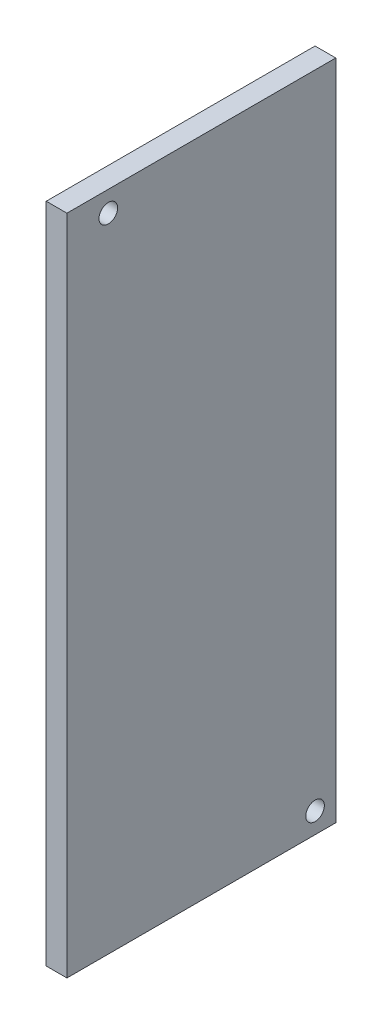
ISO-10303-21;
HEADER;
FILE_DESCRIPTION(('STEP AP214'),'2;1');
FILE_NAME('part.step','',(''),(''),'','','');
FILE_SCHEMA(('AUTOMOTIVE_DESIGN { 1 0 10303 214 1 1 1 1 }'));
ENDSEC;
DATA;
#1=APPLICATION_CONTEXT('core data for automotive mechanical design processes');
#2=APPLICATION_PROTOCOL_DEFINITION('international standard','automotive_design',2000,#1);
#3=PRODUCT_CONTEXT('',#1,'mechanical');
#4=PRODUCT('Part','Part','',(#3));
#5=PRODUCT_RELATED_PRODUCT_CATEGORY('part','',(#4));
#6=PRODUCT_DEFINITION_FORMATION('','',#4);
#7=PRODUCT_DEFINITION_CONTEXT('part definition',#1,'design');
#8=PRODUCT_DEFINITION('design','',#6,#7);
#9=PRODUCT_DEFINITION_SHAPE('','',#8);
#10=(LENGTH_UNIT() NAMED_UNIT(*) SI_UNIT(.MILLI.,.METRE.));
#11=(NAMED_UNIT(*) PLANE_ANGLE_UNIT() SI_UNIT($,.RADIAN.));
#12=(NAMED_UNIT(*) SI_UNIT($,.STERADIAN.) SOLID_ANGLE_UNIT());
#13=UNCERTAINTY_MEASURE_WITH_UNIT(LENGTH_MEASURE(1.E-05),#10,'distance_accuracy_value','');
#14=(GEOMETRIC_REPRESENTATION_CONTEXT(3) GLOBAL_UNCERTAINTY_ASSIGNED_CONTEXT((#13)) GLOBAL_UNIT_ASSIGNED_CONTEXT((#10,
#11,#12)) REPRESENTATION_CONTEXT('',''));
#15=CARTESIAN_POINT('',(0.,0.,0.));
#16=DIRECTION('',(0.,0.,1.));
#17=DIRECTION('',(1.,0.,0.));
#18=AXIS2_PLACEMENT_3D('',#15,#16,#17);
#19=CARTESIAN_POINT('',(5.,-80.,32.47));
#20=DIRECTION('',(0.,1.,0.));
#21=DIRECTION('',(0.,0.,1.));
#22=AXIS2_PLACEMENT_3D('',#19,#20,#21);
#23=PLANE('',#22);
#24=DIRECTION('',(0.,0.,-1.));
#25=VECTOR('',#24,1.);
#26=CARTESIAN_POINT('',(0.,-80.,32.47));
#27=LINE('',#26,#25);
#28=CARTESIAN_POINT('',(0.,-80.,32.47));
#29=VERTEX_POINT('',#28);
#30=CARTESIAN_POINT('',(0.,-80.,-32.47));
#31=VERTEX_POINT('',#30);
#32=EDGE_CURVE('E113',#29,#31,#27,.T.);
#33=ORIENTED_EDGE('',*,*,#32,.T.);
#34=DIRECTION('',(-1.,0.,0.));
#35=VECTOR('',#34,1.);
#36=CARTESIAN_POINT('',(5.,-80.,-32.47));
#37=LINE('',#36,#35);
#38=CARTESIAN_POINT('',(5.,-80.,-32.47));
#39=VERTEX_POINT('',#38);
#40=EDGE_CURVE('E11',#39,#31,#37,.T.);
#41=ORIENTED_EDGE('',*,*,#40,.F.);
#42=DIRECTION('',(0.,0.,-1.));
#43=VECTOR('',#42,1.);
#44=CARTESIAN_POINT('',(5.,-80.,32.47));
#45=LINE('',#44,#43);
#46=CARTESIAN_POINT('',(5.,-80.,32.47));
#47=VERTEX_POINT('',#46);
#48=EDGE_CURVE('E97',#47,#39,#45,.T.);
#49=ORIENTED_EDGE('',*,*,#48,.F.);
#50=DIRECTION('',(-1.,0.,0.));
#51=VECTOR('',#50,1.);
#52=CARTESIAN_POINT('',(5.,-80.,32.47));
#53=LINE('',#52,#51);
#54=EDGE_CURVE('E109',#47,#29,#53,.T.);
#55=ORIENTED_EDGE('',*,*,#54,.T.);
#56=EDGE_LOOP('',(#33,#41,#49,#55));
#57=FACE_BOUND('',#56,.T.);
#58=ADVANCED_FACE('F45',(#57),#23,.F.);
#59=CARTESIAN_POINT('',(5.,80.,-32.47));
#60=DIRECTION('',(0.,0.,1.));
#61=DIRECTION('',(0.,-1.,0.));
#62=AXIS2_PLACEMENT_3D('',#59,#60,#61);
#63=PLANE('',#62);
#64=DIRECTION('',(0.,1.,0.));
#65=VECTOR('',#64,1.);
#66=CARTESIAN_POINT('',(0.,80.,-32.47));
#67=LINE('',#66,#65);
#68=CARTESIAN_POINT('',(0.,80.,-32.47));
#69=VERTEX_POINT('',#68);
#70=EDGE_CURVE('E102',#31,#69,#67,.T.);
#71=ORIENTED_EDGE('',*,*,#70,.T.);
#72=DIRECTION('',(-1.,0.,0.));
#73=VECTOR('',#72,1.);
#74=CARTESIAN_POINT('',(5.,80.,-32.47));
#75=LINE('',#74,#73);
#76=CARTESIAN_POINT('',(5.,80.,-32.47));
#77=VERTEX_POINT('',#76);
#78=EDGE_CURVE('E54',#77,#69,#75,.T.);
#79=ORIENTED_EDGE('',*,*,#78,.F.);
#80=DIRECTION('',(0.,1.,0.));
#81=VECTOR('',#80,1.);
#82=CARTESIAN_POINT('',(5.,80.,-32.47));
#83=LINE('',#82,#81);
#84=EDGE_CURVE('E92',#39,#77,#83,.T.);
#85=ORIENTED_EDGE('',*,*,#84,.F.);
#86=ORIENTED_EDGE('',*,*,#40,.T.);
#87=EDGE_LOOP('',(#71,#79,#85,#86));
#88=FACE_BOUND('',#87,.T.);
#89=ADVANCED_FACE('F101',(#88),#63,.F.);
#90=CARTESIAN_POINT('',(5.,80.,32.47));
#91=DIRECTION('',(0.,-1.,0.));
#92=DIRECTION('',(0.,0.,-1.));
#93=AXIS2_PLACEMENT_3D('',#90,#91,#92);
#94=PLANE('',#93);
#95=DIRECTION('',(0.,0.,1.));
#96=VECTOR('',#95,1.);
#97=CARTESIAN_POINT('',(0.,80.,32.47));
#98=LINE('',#97,#96);
#99=CARTESIAN_POINT('',(0.,80.,32.47));
#100=VERTEX_POINT('',#99);
#101=EDGE_CURVE('E79',#69,#100,#98,.T.);
#102=ORIENTED_EDGE('',*,*,#101,.T.);
#103=DIRECTION('',(-1.,0.,0.));
#104=VECTOR('',#103,1.);
#105=CARTESIAN_POINT('',(5.,80.,32.47));
#106=LINE('',#105,#104);
#107=CARTESIAN_POINT('',(5.,80.,32.47));
#108=VERTEX_POINT('',#107);
#109=EDGE_CURVE('E104',#108,#100,#106,.T.);
#110=ORIENTED_EDGE('',*,*,#109,.F.);
#111=DIRECTION('',(0.,0.,1.));
#112=VECTOR('',#111,1.);
#113=CARTESIAN_POINT('',(5.,80.,32.47));
#114=LINE('',#113,#112);
#115=EDGE_CURVE('E95',#77,#108,#114,.T.);
#116=ORIENTED_EDGE('',*,*,#115,.F.);
#117=ORIENTED_EDGE('',*,*,#78,.T.);
#118=EDGE_LOOP('',(#102,#110,#116,#117));
#119=FACE_BOUND('',#118,.T.);
#120=ADVANCED_FACE('F105',(#119),#94,.F.);
#121=CARTESIAN_POINT('',(5.,80.,32.47));
#122=DIRECTION('',(0.,0.,-1.));
#123=DIRECTION('',(0.,1.,0.));
#124=AXIS2_PLACEMENT_3D('',#121,#122,#123);
#125=PLANE('',#124);
#126=DIRECTION('',(0.,-1.,0.));
#127=VECTOR('',#126,1.);
#128=CARTESIAN_POINT('',(0.,80.,32.47));
#129=LINE('',#128,#127);
#130=EDGE_CURVE('E85',#100,#29,#129,.T.);
#131=ORIENTED_EDGE('',*,*,#130,.T.);
#132=ORIENTED_EDGE('',*,*,#54,.F.);
#133=DIRECTION('',(0.,-1.,0.));
#134=VECTOR('',#133,1.);
#135=CARTESIAN_POINT('',(5.,80.,32.47));
#136=LINE('',#135,#134);
#137=EDGE_CURVE('E62',#108,#47,#136,.T.);
#138=ORIENTED_EDGE('',*,*,#137,.F.);
#139=ORIENTED_EDGE('',*,*,#109,.T.);
#140=EDGE_LOOP('',(#131,#132,#138,#139));
#141=FACE_BOUND('',#140,.T.);
#142=ADVANCED_FACE('F127',(#141),#125,.F.);
#143=CARTESIAN_POINT('',(5.,0.,0.));
#144=DIRECTION('',(-1.,0.,0.));
#145=DIRECTION('',(0.,0.,1.));
#146=AXIS2_PLACEMENT_3D('',#143,#144,#145);
#147=PLANE('',#146);
#148=CARTESIAN_POINT('',(5.,-75.,-27.47));
#149=DIRECTION('',(-1.,0.,0.));
#150=DIRECTION('',(0.,0.,1.));
#151=AXIS2_PLACEMENT_3D('',#148,#149,#150);
#152=CIRCLE('',#151,2.25);
#153=CARTESIAN_POINT('',(5.,-75.,-25.22));
#154=VERTEX_POINT('',#153);
#155=EDGE_CURVE('E117',#154,#154,#152,.T.);
#156=ORIENTED_EDGE('',*,*,#155,.T.);
#157=EDGE_LOOP('',(#156));
#158=FACE_BOUND('',#157,.T.);
#159=CARTESIAN_POINT('',(5.,75.,22.47));
#160=DIRECTION('',(-1.,0.,0.));
#161=DIRECTION('',(0.,0.,1.));
#162=AXIS2_PLACEMENT_3D('',#159,#160,#161);
#163=CIRCLE('',#162,2.25);
#164=CARTESIAN_POINT('',(5.,75.,24.72));
#165=VERTEX_POINT('',#164);
#166=EDGE_CURVE('E137',#165,#165,#163,.T.);
#167=ORIENTED_EDGE('',*,*,#166,.T.);
#168=EDGE_LOOP('',(#167));
#169=FACE_BOUND('',#168,.T.);
#170=ORIENTED_EDGE('',*,*,#48,.T.);
#171=ORIENTED_EDGE('',*,*,#84,.T.);
#172=ORIENTED_EDGE('',*,*,#115,.T.);
#173=ORIENTED_EDGE('',*,*,#137,.T.);
#174=EDGE_LOOP('',(#170,#171,#172,#173));
#175=FACE_BOUND('',#174,.T.);
#176=ADVANCED_FACE('F93',(#158,#169,#175),#147,.F.);
#177=CARTESIAN_POINT('',(0.,0.,0.));
#178=DIRECTION('',(-1.,0.,0.));
#179=DIRECTION('',(0.,0.,1.));
#180=AXIS2_PLACEMENT_3D('',#177,#178,#179);
#181=PLANE('',#180);
#182=CARTESIAN_POINT('',(0.,-75.,-27.47));
#183=DIRECTION('',(1.,0.,0.));
#184=DIRECTION('',(0.,0.,-1.));
#185=AXIS2_PLACEMENT_3D('',#182,#183,#184);
#186=CIRCLE('',#185,2.25);
#187=CARTESIAN_POINT('',(0.,-75.,-29.72));
#188=VERTEX_POINT('',#187);
#189=EDGE_CURVE('E141',#188,#188,#186,.T.);
#190=ORIENTED_EDGE('',*,*,#189,.T.);
#191=EDGE_LOOP('',(#190));
#192=FACE_BOUND('',#191,.T.);
#193=CARTESIAN_POINT('',(0.,75.,22.47));
#194=DIRECTION('',(1.,0.,0.));
#195=DIRECTION('',(0.,0.,-1.));
#196=AXIS2_PLACEMENT_3D('',#193,#194,#195);
#197=CIRCLE('',#196,2.25);
#198=CARTESIAN_POINT('',(0.,75.,20.22));
#199=VERTEX_POINT('',#198);
#200=EDGE_CURVE('E142',#199,#199,#197,.T.);
#201=ORIENTED_EDGE('',*,*,#200,.T.);
#202=EDGE_LOOP('',(#201));
#203=FACE_BOUND('',#202,.T.);
#204=ORIENTED_EDGE('',*,*,#32,.F.);
#205=ORIENTED_EDGE('',*,*,#130,.F.);
#206=ORIENTED_EDGE('',*,*,#101,.F.);
#207=ORIENTED_EDGE('',*,*,#70,.F.);
#208=EDGE_LOOP('',(#204,#205,#206,#207));
#209=FACE_BOUND('',#208,.T.);
#210=ADVANCED_FACE('F130',(#192,#203,#209),#181,.T.);
#211=CARTESIAN_POINT('',(0.,75.,22.47));
#212=DIRECTION('',(1.,0.,0.));
#213=DIRECTION('',(0.,0.,-1.));
#214=AXIS2_PLACEMENT_3D('',#211,#212,#213);
#215=CYLINDRICAL_SURFACE('',#214,2.25);
#216=ORIENTED_EDGE('',*,*,#200,.F.);
#217=EDGE_LOOP('',(#216));
#218=FACE_BOUND('',#217,.T.);
#219=ORIENTED_EDGE('',*,*,#166,.F.);
#220=EDGE_LOOP('',(#219));
#221=FACE_BOUND('',#220,.T.);
#222=ADVANCED_FACE('F155',(#218,#221),#215,.F.);
#223=CARTESIAN_POINT('',(0.,-75.,-27.47));
#224=DIRECTION('',(1.,0.,0.));
#225=DIRECTION('',(0.,0.,-1.));
#226=AXIS2_PLACEMENT_3D('',#223,#224,#225);
#227=CYLINDRICAL_SURFACE('',#226,2.25);
#228=ORIENTED_EDGE('',*,*,#189,.F.);
#229=EDGE_LOOP('',(#228));
#230=FACE_BOUND('',#229,.T.);
#231=ORIENTED_EDGE('',*,*,#155,.F.);
#232=EDGE_LOOP('',(#231));
#233=FACE_BOUND('',#232,.T.);
#234=ADVANCED_FACE('F152',(#230,#233),#227,.F.);
#235=CLOSED_SHELL('',(#58,#89,#120,#142,#176,#210,#222,#234));
#236=MANIFOLD_SOLID_BREP('B2',#235);
#237=ADVANCED_BREP_SHAPE_REPRESENTATION('',(#18,#236),#14);
#238=SHAPE_DEFINITION_REPRESENTATION(#9,#237);
ENDSEC;
END-ISO-10303-21;
